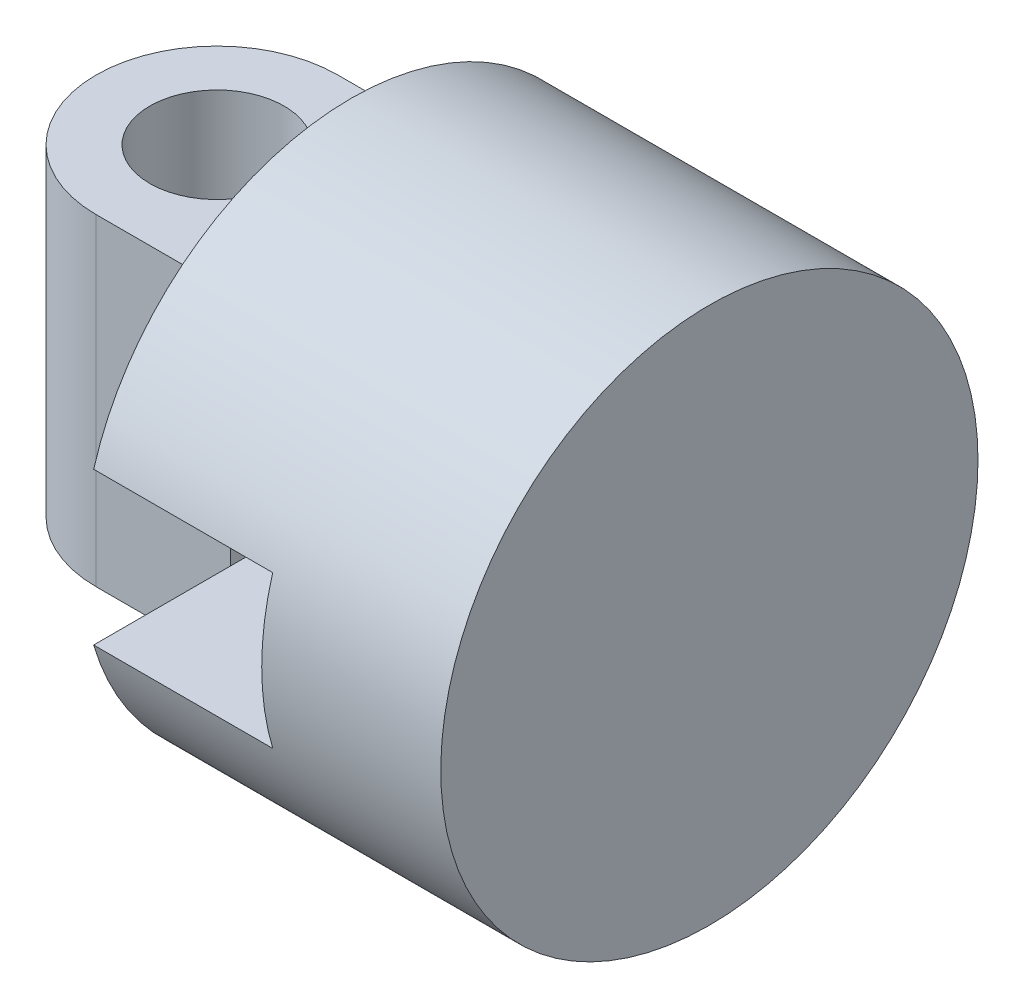
ISO-10303-21;
HEADER;
FILE_DESCRIPTION(('STEP AP214'),'2;1');
FILE_NAME('part.step','',(''),(''),'','','');
FILE_SCHEMA(('AUTOMOTIVE_DESIGN { 1 0 10303 214 1 1 1 1 }'));
ENDSEC;
DATA;
#1=APPLICATION_CONTEXT('core data for automotive mechanical design processes');
#2=APPLICATION_PROTOCOL_DEFINITION('international standard','automotive_design',2000,#1);
#3=PRODUCT_CONTEXT('',#1,'mechanical');
#4=PRODUCT('Part','Part','',(#3));
#5=PRODUCT_RELATED_PRODUCT_CATEGORY('part','',(#4));
#6=PRODUCT_DEFINITION_FORMATION('','',#4);
#7=PRODUCT_DEFINITION_CONTEXT('part definition',#1,'design');
#8=PRODUCT_DEFINITION('design','',#6,#7);
#9=PRODUCT_DEFINITION_SHAPE('','',#8);
#10=(LENGTH_UNIT() NAMED_UNIT(*) SI_UNIT(.MILLI.,.METRE.));
#11=(NAMED_UNIT(*) PLANE_ANGLE_UNIT() SI_UNIT($,.RADIAN.));
#12=(NAMED_UNIT(*) SI_UNIT($,.STERADIAN.) SOLID_ANGLE_UNIT());
#13=UNCERTAINTY_MEASURE_WITH_UNIT(LENGTH_MEASURE(1.E-05),#10,'distance_accuracy_value','');
#14=(GEOMETRIC_REPRESENTATION_CONTEXT(3) GLOBAL_UNCERTAINTY_ASSIGNED_CONTEXT((#13)) GLOBAL_UNIT_ASSIGNED_CONTEXT((#10,
#11,#12)) REPRESENTATION_CONTEXT('',''));
#15=CARTESIAN_POINT('',(0.,0.,0.));
#16=DIRECTION('',(0.,0.,1.));
#17=DIRECTION('',(1.,0.,0.));
#18=AXIS2_PLACEMENT_3D('',#15,#16,#17);
#19=CARTESIAN_POINT('',(0.,0.,0.));
#20=DIRECTION('',(1.,0.,0.));
#21=DIRECTION('',(0.,0.,-1.));
#22=AXIS2_PLACEMENT_3D('',#19,#20,#21);
#23=PLANE('',#22);
#24=CARTESIAN_POINT('',(0.,0.,0.));
#25=DIRECTION('',(1.,0.,0.));
#26=DIRECTION('',(0.,0.,-1.));
#27=AXIS2_PLACEMENT_3D('',#24,#25,#26);
#28=CIRCLE('',#27,30.);
#29=CARTESIAN_POINT('',(0.,8.5,-28.7706447616316));
#30=VERTEX_POINT('',#29);
#31=CARTESIAN_POINT('',(0.,8.5,28.7706447616316));
#32=VERTEX_POINT('',#31);
#33=EDGE_CURVE('E137',#30,#32,#28,.T.);
#34=ORIENTED_EDGE('',*,*,#33,.F.);
#35=DIRECTION('',(0.,0.,1.));
#36=VECTOR('',#35,1.);
#37=CARTESIAN_POINT('',(0.,8.5,-30.));
#38=LINE('',#37,#36);
#39=CARTESIAN_POINT('',(0.,8.5,-13.5));
#40=VERTEX_POINT('',#39);
#41=EDGE_CURVE('E165',#30,#40,#38,.T.);
#42=ORIENTED_EDGE('',*,*,#41,.T.);
#43=DIRECTION('',(0.,1.,0.));
#44=VECTOR('',#43,1.);
#45=CARTESIAN_POINT('',(0.,-18.,-13.5));
#46=LINE('',#45,#44);
#47=CARTESIAN_POINT('',(0.,18.,-13.5));
#48=VERTEX_POINT('',#47);
#49=EDGE_CURVE('E141',#40,#48,#46,.T.);
#50=ORIENTED_EDGE('',*,*,#49,.T.);
#51=DIRECTION('',(0.,0.,1.));
#52=VECTOR('',#51,1.);
#53=CARTESIAN_POINT('',(0.,18.,0.));
#54=LINE('',#53,#52);
#55=CARTESIAN_POINT('',(0.,18.,13.5));
#56=VERTEX_POINT('',#55);
#57=EDGE_CURVE('E183',#48,#56,#54,.T.);
#58=ORIENTED_EDGE('',*,*,#57,.T.);
#59=DIRECTION('',(0.,1.,0.));
#60=VECTOR('',#59,1.);
#61=CARTESIAN_POINT('',(0.,-18.,13.5));
#62=LINE('',#61,#60);
#63=CARTESIAN_POINT('',(0.,8.5,13.5));
#64=VERTEX_POINT('',#63);
#65=EDGE_CURVE('E162',#64,#56,#62,.T.);
#66=ORIENTED_EDGE('',*,*,#65,.F.);
#67=EDGE_CURVE('E154',#64,#32,#38,.T.);
#68=ORIENTED_EDGE('',*,*,#67,.T.);
#69=EDGE_LOOP('',(#34,#42,#50,#58,#66,#68));
#70=FACE_BOUND('',#69,.T.);
#71=ADVANCED_FACE('F37',(#70),#23,.F.);
#72=CARTESIAN_POINT('',(0.,-8.5,28.7706447616316));
#73=VERTEX_POINT('',#72);
#74=CARTESIAN_POINT('',(0.,-8.5,-28.7706447616316));
#75=VERTEX_POINT('',#74);
#76=EDGE_CURVE('E127',#73,#75,#28,.T.);
#77=ORIENTED_EDGE('',*,*,#76,.F.);
#78=DIRECTION('',(0.,0.,1.));
#79=VECTOR('',#78,1.);
#80=CARTESIAN_POINT('',(0.,-8.5,-30.));
#81=LINE('',#80,#79);
#82=CARTESIAN_POINT('',(0.,-8.5,13.5));
#83=VERTEX_POINT('',#82);
#84=EDGE_CURVE('E133',#83,#73,#81,.T.);
#85=ORIENTED_EDGE('',*,*,#84,.F.);
#86=CARTESIAN_POINT('',(0.,-18.,13.5));
#87=VERTEX_POINT('',#86);
#88=EDGE_CURVE('E201',#87,#83,#62,.T.);
#89=ORIENTED_EDGE('',*,*,#88,.F.);
#90=DIRECTION('',(0.,0.,1.));
#91=VECTOR('',#90,1.);
#92=CARTESIAN_POINT('',(0.,-18.,0.));
#93=LINE('',#92,#91);
#94=CARTESIAN_POINT('',(0.,-18.,-13.5));
#95=VERTEX_POINT('',#94);
#96=EDGE_CURVE('E195',#95,#87,#93,.T.);
#97=ORIENTED_EDGE('',*,*,#96,.F.);
#98=CARTESIAN_POINT('',(0.,-8.5,-13.5));
#99=VERTEX_POINT('',#98);
#100=EDGE_CURVE('E130',#95,#99,#46,.T.);
#101=ORIENTED_EDGE('',*,*,#100,.T.);
#102=EDGE_CURVE('E52',#75,#99,#81,.T.);
#103=ORIENTED_EDGE('',*,*,#102,.F.);
#104=EDGE_LOOP('',(#77,#85,#89,#97,#101,#103));
#105=FACE_BOUND('',#104,.T.);
#106=ADVANCED_FACE('F125',(#105),#23,.F.);
#107=CARTESIAN_POINT('',(40.,0.,0.));
#108=DIRECTION('',(-1.,0.,0.));
#109=DIRECTION('',(0.,0.,1.));
#110=AXIS2_PLACEMENT_3D('',#107,#108,#109);
#111=CYLINDRICAL_SURFACE('',#110,30.);
#112=CARTESIAN_POINT('',(40.,0.,0.));
#113=DIRECTION('',(1.,0.,0.));
#114=DIRECTION('',(0.,0.,-1.));
#115=AXIS2_PLACEMENT_3D('',#112,#113,#114);
#116=CIRCLE('',#115,30.);
#117=CARTESIAN_POINT('',(40.,0.,-30.));
#118=VERTEX_POINT('',#117);
#119=EDGE_CURVE('E140',#118,#118,#116,.T.);
#120=ORIENTED_EDGE('',*,*,#119,.F.);
#121=EDGE_LOOP('',(#120));
#122=FACE_BOUND('',#121,.T.);
#123=CARTESIAN_POINT('',(20.,0.,0.));
#124=DIRECTION('',(1.,0.,0.));
#125=DIRECTION('',(0.,0.,-1.));
#126=AXIS2_PLACEMENT_3D('',#123,#124,#125);
#127=CIRCLE('',#126,30.);
#128=CARTESIAN_POINT('',(20.,-8.49999999999999,-28.7706447616316));
#129=VERTEX_POINT('',#128);
#130=CARTESIAN_POINT('',(20.,8.50000000000001,-28.7706447616316));
#131=VERTEX_POINT('',#130);
#132=EDGE_CURVE('E120',#129,#131,#127,.T.);
#133=ORIENTED_EDGE('',*,*,#132,.T.);
#134=DIRECTION('',(-1.,0.,0.));
#135=VECTOR('',#134,1.);
#136=CARTESIAN_POINT('',(40.,8.50000000000001,-28.7706447616316));
#137=LINE('',#136,#135);
#138=EDGE_CURVE('E11',#131,#30,#137,.T.);
#139=ORIENTED_EDGE('',*,*,#138,.T.);
#140=ORIENTED_EDGE('',*,*,#33,.T.);
#141=DIRECTION('',(-1.,0.,0.));
#142=VECTOR('',#141,1.);
#143=CARTESIAN_POINT('',(40.,8.50000000000001,28.7706447616316));
#144=LINE('',#143,#142);
#145=CARTESIAN_POINT('',(20.,8.50000000000001,28.7706447616316));
#146=VERTEX_POINT('',#145);
#147=EDGE_CURVE('E45',#32,#146,#144,.F.);
#148=ORIENTED_EDGE('',*,*,#147,.T.);
#149=CARTESIAN_POINT('',(20.,-8.49999999999999,28.7706447616316));
#150=VERTEX_POINT('',#149);
#151=EDGE_CURVE('E146',#146,#150,#127,.T.);
#152=ORIENTED_EDGE('',*,*,#151,.T.);
#153=DIRECTION('',(-1.,0.,0.));
#154=VECTOR('',#153,1.);
#155=CARTESIAN_POINT('',(40.,-8.49999999999999,28.7706447616316));
#156=LINE('',#155,#154);
#157=EDGE_CURVE('E136',#150,#73,#156,.T.);
#158=ORIENTED_EDGE('',*,*,#157,.T.);
#159=ORIENTED_EDGE('',*,*,#76,.T.);
#160=DIRECTION('',(-1.,0.,0.));
#161=VECTOR('',#160,1.);
#162=CARTESIAN_POINT('',(40.,-8.49999999999999,-28.7706447616316));
#163=LINE('',#162,#161);
#164=EDGE_CURVE('E114',#75,#129,#163,.F.);
#165=ORIENTED_EDGE('',*,*,#164,.T.);
#166=EDGE_LOOP('',(#133,#139,#140,#148,#152,#158,#159,#165));
#167=FACE_BOUND('',#166,.T.);
#168=ADVANCED_FACE('F39',(#122,#167),#111,.T.);
#169=CARTESIAN_POINT('',(40.,0.,0.));
#170=DIRECTION('',(1.,0.,0.));
#171=DIRECTION('',(0.,0.,-1.));
#172=AXIS2_PLACEMENT_3D('',#169,#170,#171);
#173=PLANE('',#172);
#174=ORIENTED_EDGE('',*,*,#119,.T.);
#175=EDGE_LOOP('',(#174));
#176=FACE_BOUND('',#175,.T.);
#177=ADVANCED_FACE('F249',(#176),#173,.T.);
#178=CARTESIAN_POINT('',(0.,-18.,-13.5));
#179=DIRECTION('',(0.,0.,1.));
#180=DIRECTION('',(1.,0.,0.));
#181=AXIS2_PLACEMENT_3D('',#178,#179,#180);
#182=PLANE('',#181);
#183=DIRECTION('',(0.,1.,0.));
#184=VECTOR('',#183,1.);
#185=CARTESIAN_POINT('',(-15.,-18.,-13.5));
#186=LINE('',#185,#184);
#187=CARTESIAN_POINT('',(-15.,-18.,-13.5));
#188=VERTEX_POINT('',#187);
#189=CARTESIAN_POINT('',(-15.,18.,-13.5));
#190=VERTEX_POINT('',#189);
#191=EDGE_CURVE('E199',#188,#190,#186,.T.);
#192=ORIENTED_EDGE('',*,*,#191,.T.);
#193=DIRECTION('',(1.,0.,0.));
#194=VECTOR('',#193,1.);
#195=CARTESIAN_POINT('',(0.,18.,-13.5));
#196=LINE('',#195,#194);
#197=EDGE_CURVE('E170',#190,#48,#196,.T.);
#198=ORIENTED_EDGE('',*,*,#197,.T.);
#199=ORIENTED_EDGE('',*,*,#49,.F.);
#200=DIRECTION('',(0.,-1.,0.));
#201=VECTOR('',#200,1.);
#202=CARTESIAN_POINT('',(0.,-18.,-13.5));
#203=LINE('',#202,#201);
#204=EDGE_CURVE('E167',#40,#99,#203,.T.);
#205=ORIENTED_EDGE('',*,*,#204,.T.);
#206=ORIENTED_EDGE('',*,*,#100,.F.);
#207=DIRECTION('',(1.,0.,0.));
#208=VECTOR('',#207,1.);
#209=CARTESIAN_POINT('',(0.,-18.,-13.5));
#210=LINE('',#209,#208);
#211=EDGE_CURVE('E188',#188,#95,#210,.T.);
#212=ORIENTED_EDGE('',*,*,#211,.F.);
#213=EDGE_LOOP('',(#192,#198,#199,#205,#206,#212));
#214=FACE_BOUND('',#213,.T.);
#215=ADVANCED_FACE('F208',(#214),#182,.F.);
#216=CARTESIAN_POINT('',(0.,-18.,13.5));
#217=DIRECTION('',(0.,0.,-1.));
#218=DIRECTION('',(-1.,0.,0.));
#219=AXIS2_PLACEMENT_3D('',#216,#217,#218);
#220=PLANE('',#219);
#221=ORIENTED_EDGE('',*,*,#88,.T.);
#222=EDGE_CURVE('E204',#83,#64,#62,.T.);
#223=ORIENTED_EDGE('',*,*,#222,.T.);
#224=ORIENTED_EDGE('',*,*,#65,.T.);
#225=DIRECTION('',(-1.,0.,0.));
#226=VECTOR('',#225,1.);
#227=CARTESIAN_POINT('',(0.,18.,13.5));
#228=LINE('',#227,#226);
#229=CARTESIAN_POINT('',(-15.,18.,13.5));
#230=VERTEX_POINT('',#229);
#231=EDGE_CURVE('E180',#56,#230,#228,.T.);
#232=ORIENTED_EDGE('',*,*,#231,.T.);
#233=DIRECTION('',(0.,1.,0.));
#234=VECTOR('',#233,1.);
#235=CARTESIAN_POINT('',(-15.,-18.,13.5));
#236=LINE('',#235,#234);
#237=CARTESIAN_POINT('',(-15.,-18.,13.5));
#238=VERTEX_POINT('',#237);
#239=EDGE_CURVE('E205',#238,#230,#236,.T.);
#240=ORIENTED_EDGE('',*,*,#239,.F.);
#241=DIRECTION('',(-1.,0.,0.));
#242=VECTOR('',#241,1.);
#243=CARTESIAN_POINT('',(0.,-18.,13.5));
#244=LINE('',#243,#242);
#245=EDGE_CURVE('E193',#87,#238,#244,.T.);
#246=ORIENTED_EDGE('',*,*,#245,.F.);
#247=EDGE_LOOP('',(#221,#223,#224,#232,#240,#246));
#248=FACE_BOUND('',#247,.T.);
#249=ADVANCED_FACE('F220',(#248),#220,.F.);
#250=CARTESIAN_POINT('',(-15.,-18.,0.));
#251=DIRECTION('',(0.,1.,0.));
#252=DIRECTION('',(0.,0.,1.));
#253=AXIS2_PLACEMENT_3D('',#250,#251,#252);
#254=CYLINDRICAL_SURFACE('',#253,13.5);
#255=ORIENTED_EDGE('',*,*,#239,.T.);
#256=CARTESIAN_POINT('',(-15.,18.,0.));
#257=DIRECTION('',(0.,1.,0.));
#258=DIRECTION('',(0.,0.,1.));
#259=AXIS2_PLACEMENT_3D('',#256,#257,#258);
#260=CIRCLE('',#259,13.5);
#261=EDGE_CURVE('E174',#190,#230,#260,.T.);
#262=ORIENTED_EDGE('',*,*,#261,.F.);
#263=ORIENTED_EDGE('',*,*,#191,.F.);
#264=CARTESIAN_POINT('',(-15.,-18.,0.));
#265=DIRECTION('',(0.,1.,0.));
#266=DIRECTION('',(0.,0.,1.));
#267=AXIS2_PLACEMENT_3D('',#264,#265,#266);
#268=CIRCLE('',#267,13.5);
#269=EDGE_CURVE('E190',#188,#238,#268,.T.);
#270=ORIENTED_EDGE('',*,*,#269,.T.);
#271=EDGE_LOOP('',(#255,#262,#263,#270));
#272=FACE_BOUND('',#271,.T.);
#273=ADVANCED_FACE('F213',(#272),#254,.T.);
#274=CARTESIAN_POINT('',(-15.,-18.,0.));
#275=DIRECTION('',(0.,1.,0.));
#276=DIRECTION('',(0.,0.,1.));
#277=AXIS2_PLACEMENT_3D('',#274,#275,#276);
#278=CYLINDRICAL_SURFACE('',#277,7.5);
#279=CARTESIAN_POINT('',(-15.,-18.,0.));
#280=DIRECTION('',(0.,1.,0.));
#281=DIRECTION('',(0.,0.,1.));
#282=AXIS2_PLACEMENT_3D('',#279,#280,#281);
#283=CIRCLE('',#282,7.5);
#284=CARTESIAN_POINT('',(-15.,-18.,7.5));
#285=VERTEX_POINT('',#284);
#286=EDGE_CURVE('E197',#285,#285,#283,.T.);
#287=ORIENTED_EDGE('',*,*,#286,.F.);
#288=EDGE_LOOP('',(#287));
#289=FACE_BOUND('',#288,.T.);
#290=CARTESIAN_POINT('',(-15.,18.,0.));
#291=DIRECTION('',(0.,1.,0.));
#292=DIRECTION('',(0.,0.,1.));
#293=AXIS2_PLACEMENT_3D('',#290,#291,#292);
#294=CIRCLE('',#293,7.5);
#295=CARTESIAN_POINT('',(-15.,18.,7.5));
#296=VERTEX_POINT('',#295);
#297=EDGE_CURVE('E185',#296,#296,#294,.T.);
#298=ORIENTED_EDGE('',*,*,#297,.T.);
#299=EDGE_LOOP('',(#298));
#300=FACE_BOUND('',#299,.T.);
#301=ADVANCED_FACE('F228',(#289,#300),#278,.F.);
#302=CARTESIAN_POINT('',(0.,-18.,0.));
#303=DIRECTION('',(0.,1.,0.));
#304=DIRECTION('',(0.,0.,1.));
#305=AXIS2_PLACEMENT_3D('',#302,#303,#304);
#306=PLANE('',#305);
#307=ORIENTED_EDGE('',*,*,#211,.T.);
#308=ORIENTED_EDGE('',*,*,#96,.T.);
#309=ORIENTED_EDGE('',*,*,#245,.T.);
#310=ORIENTED_EDGE('',*,*,#269,.F.);
#311=EDGE_LOOP('',(#307,#308,#309,#310));
#312=FACE_BOUND('',#311,.T.);
#313=ORIENTED_EDGE('',*,*,#286,.T.);
#314=EDGE_LOOP('',(#313));
#315=FACE_BOUND('',#314,.T.);
#316=ADVANCED_FACE('F225',(#312,#315),#306,.F.);
#317=CARTESIAN_POINT('',(0.,18.,0.));
#318=DIRECTION('',(0.,1.,0.));
#319=DIRECTION('',(0.,0.,1.));
#320=AXIS2_PLACEMENT_3D('',#317,#318,#319);
#321=PLANE('',#320);
#322=ORIENTED_EDGE('',*,*,#197,.F.);
#323=ORIENTED_EDGE('',*,*,#261,.T.);
#324=ORIENTED_EDGE('',*,*,#231,.F.);
#325=ORIENTED_EDGE('',*,*,#57,.F.);
#326=EDGE_LOOP('',(#322,#323,#324,#325));
#327=FACE_BOUND('',#326,.T.);
#328=ORIENTED_EDGE('',*,*,#297,.F.);
#329=EDGE_LOOP('',(#328));
#330=FACE_BOUND('',#329,.T.);
#331=ADVANCED_FACE('F217',(#327,#330),#321,.T.);
#332=CARTESIAN_POINT('',(20.,8.50000000000001,-30.));
#333=DIRECTION('',(0.,1.,0.));
#334=DIRECTION('',(-1.,0.,0.));
#335=AXIS2_PLACEMENT_3D('',#332,#333,#334);
#336=PLANE('',#335);
#337=DIRECTION('',(0.,0.,1.));
#338=VECTOR('',#337,1.);
#339=CARTESIAN_POINT('',(20.,8.50000000000001,-30.));
#340=LINE('',#339,#338);
#341=EDGE_CURVE('E158',#131,#146,#340,.T.);
#342=ORIENTED_EDGE('',*,*,#341,.T.);
#343=ORIENTED_EDGE('',*,*,#147,.F.);
#344=ORIENTED_EDGE('',*,*,#67,.F.);
#345=EDGE_CURVE('E60',#40,#64,#38,.T.);
#346=ORIENTED_EDGE('',*,*,#345,.F.);
#347=ORIENTED_EDGE('',*,*,#41,.F.);
#348=ORIENTED_EDGE('',*,*,#138,.F.);
#349=EDGE_LOOP('',(#342,#343,#344,#346,#347,#348));
#350=FACE_BOUND('',#349,.T.);
#351=ADVANCED_FACE('F153',(#350),#336,.F.);
#352=CARTESIAN_POINT('',(20.,-8.49999999999999,-30.));
#353=DIRECTION('',(1.,0.,0.));
#354=DIRECTION('',(0.,0.,-1.));
#355=AXIS2_PLACEMENT_3D('',#352,#353,#354);
#356=PLANE('',#355);
#357=ORIENTED_EDGE('',*,*,#341,.F.);
#358=ORIENTED_EDGE('',*,*,#132,.F.);
#359=DIRECTION('',(0.,0.,1.));
#360=VECTOR('',#359,1.);
#361=CARTESIAN_POINT('',(20.,-8.49999999999999,-30.));
#362=LINE('',#361,#360);
#363=EDGE_CURVE('E117',#129,#150,#362,.T.);
#364=ORIENTED_EDGE('',*,*,#363,.T.);
#365=ORIENTED_EDGE('',*,*,#151,.F.);
#366=EDGE_LOOP('',(#357,#358,#364,#365));
#367=FACE_BOUND('',#366,.T.);
#368=ADVANCED_FACE('F241',(#367),#356,.F.);
#369=CARTESIAN_POINT('',(20.,-8.49999999999999,-30.));
#370=DIRECTION('',(0.,-1.,0.));
#371=DIRECTION('',(1.,0.,0.));
#372=AXIS2_PLACEMENT_3D('',#369,#370,#371);
#373=PLANE('',#372);
#374=ORIENTED_EDGE('',*,*,#363,.F.);
#375=ORIENTED_EDGE('',*,*,#164,.F.);
#376=ORIENTED_EDGE('',*,*,#102,.T.);
#377=EDGE_CURVE('E131',#99,#83,#81,.T.);
#378=ORIENTED_EDGE('',*,*,#377,.T.);
#379=ORIENTED_EDGE('',*,*,#84,.T.);
#380=ORIENTED_EDGE('',*,*,#157,.F.);
#381=EDGE_LOOP('',(#374,#375,#376,#378,#379,#380));
#382=FACE_BOUND('',#381,.T.);
#383=ADVANCED_FACE('F115',(#382),#373,.F.);
#384=CARTESIAN_POINT('',(0.,-8.5,-30.));
#385=DIRECTION('',(-1.,0.,0.));
#386=DIRECTION('',(0.,-1.,0.));
#387=AXIS2_PLACEMENT_3D('',#384,#385,#386);
#388=PLANE('',#387);
#389=ORIENTED_EDGE('',*,*,#345,.T.);
#390=ORIENTED_EDGE('',*,*,#222,.F.);
#391=ORIENTED_EDGE('',*,*,#377,.F.);
#392=ORIENTED_EDGE('',*,*,#204,.F.);
#393=EDGE_LOOP('',(#389,#390,#391,#392));
#394=FACE_BOUND('',#393,.T.);
#395=ADVANCED_FACE('F223',(#394),#388,.F.);
#396=CLOSED_SHELL('',(#71,#106,#168,#177,#215,#249,#273,#301,#316,#331,#351,#368,#383,#395));
#397=MANIFOLD_SOLID_BREP('B2',#396);
#398=ADVANCED_BREP_SHAPE_REPRESENTATION('',(#18,#397),#14);
#399=SHAPE_DEFINITION_REPRESENTATION(#9,#398);
ENDSEC;
END-ISO-10303-21;
